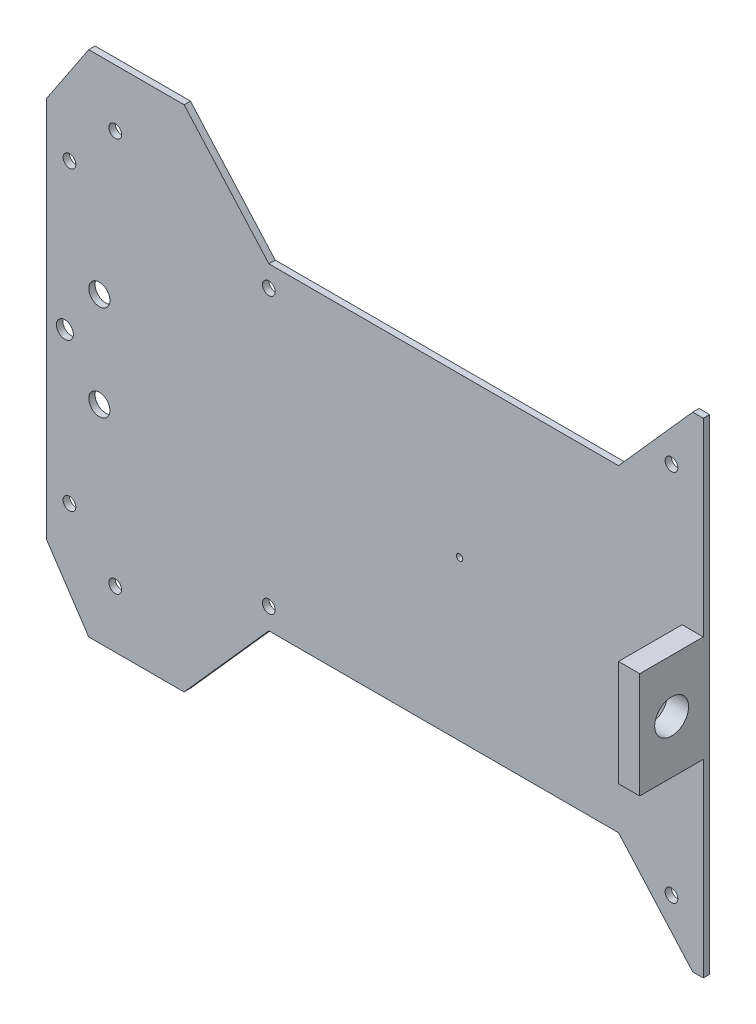
ISO-10303-21;
HEADER;
FILE_DESCRIPTION(('STEP AP214'),'2;1');
FILE_NAME('part.step','',(''),(''),'','','');
FILE_SCHEMA(('AUTOMOTIVE_DESIGN { 1 0 10303 214 1 1 1 1 }'));
ENDSEC;
DATA;
#1=APPLICATION_CONTEXT('core data for automotive mechanical design processes');
#2=APPLICATION_PROTOCOL_DEFINITION('international standard','automotive_design',2000,#1);
#3=PRODUCT_CONTEXT('',#1,'mechanical');
#4=PRODUCT('Part','Part','',(#3));
#5=PRODUCT_RELATED_PRODUCT_CATEGORY('part','',(#4));
#6=PRODUCT_DEFINITION_FORMATION('','',#4);
#7=PRODUCT_DEFINITION_CONTEXT('part definition',#1,'design');
#8=PRODUCT_DEFINITION('design','',#6,#7);
#9=PRODUCT_DEFINITION_SHAPE('','',#8);
#10=(LENGTH_UNIT() NAMED_UNIT(*) SI_UNIT(.MILLI.,.METRE.));
#11=(NAMED_UNIT(*) PLANE_ANGLE_UNIT() SI_UNIT($,.RADIAN.));
#12=(NAMED_UNIT(*) SI_UNIT($,.STERADIAN.) SOLID_ANGLE_UNIT());
#13=UNCERTAINTY_MEASURE_WITH_UNIT(LENGTH_MEASURE(1.E-05),#10,'distance_accuracy_value','');
#14=(GEOMETRIC_REPRESENTATION_CONTEXT(3) GLOBAL_UNCERTAINTY_ASSIGNED_CONTEXT((#13)) GLOBAL_UNIT_ASSIGNED_CONTEXT((#10,
#11,#12)) REPRESENTATION_CONTEXT('',''));
#15=CARTESIAN_POINT('',(0.,0.,0.));
#16=DIRECTION('',(0.,0.,1.));
#17=DIRECTION('',(1.,0.,0.));
#18=AXIS2_PLACEMENT_3D('',#15,#16,#17);
#19=CARTESIAN_POINT('',(0.,0.,3.));
#20=DIRECTION('',(0.,0.,1.));
#21=DIRECTION('',(1.,0.,0.));
#22=AXIS2_PLACEMENT_3D('',#19,#20,#21);
#23=PLANE('',#22);
#24=CARTESIAN_POINT('',(-186.250000000001,0.,3.));
#25=DIRECTION('',(0.,0.,1.));
#26=DIRECTION('',(1.,0.,0.));
#27=AXIS2_PLACEMENT_3D('',#24,#25,#26);
#28=CIRCLE('',#27,3.99999999999999);
#29=CARTESIAN_POINT('',(-182.250000000001,0.,3.));
#30=VERTEX_POINT('',#29);
#31=EDGE_CURVE('E358',#30,#30,#28,.T.);
#32=ORIENTED_EDGE('',*,*,#31,.F.);
#33=EDGE_LOOP('',(#32));
#34=FACE_BOUND('',#33,.T.);
#35=CARTESIAN_POINT('',(0.,0.,3.));
#36=DIRECTION('',(0.,0.,1.));
#37=DIRECTION('',(1.,0.,0.));
#38=AXIS2_PLACEMENT_3D('',#35,#36,#37);
#39=CIRCLE('',#38,1.5);
#40=CARTESIAN_POINT('',(1.5,0.,3.));
#41=VERTEX_POINT('',#40);
#42=EDGE_CURVE('E348',#41,#41,#39,.T.);
#43=ORIENTED_EDGE('',*,*,#42,.F.);
#44=EDGE_LOOP('',(#43));
#45=FACE_BOUND('',#44,.T.);
#46=CARTESIAN_POINT('',(-170.,-22.4999999999999,3.));
#47=DIRECTION('',(0.,0.,1.));
#48=DIRECTION('',(1.,0.,0.));
#49=AXIS2_PLACEMENT_3D('',#46,#47,#48);
#50=CIRCLE('',#49,4.99999999999999);
#51=CARTESIAN_POINT('',(-165.,-22.4999999999999,3.));
#52=VERTEX_POINT('',#51);
#53=EDGE_CURVE('E347',#52,#52,#50,.F.);
#54=ORIENTED_EDGE('',*,*,#53,.T.);
#55=EDGE_LOOP('',(#54));
#56=FACE_BOUND('',#55,.T.);
#57=CARTESIAN_POINT('',(-162.5,93.0000000000001,3.));
#58=DIRECTION('',(0.,0.,1.));
#59=DIRECTION('',(1.,0.,0.));
#60=AXIS2_PLACEMENT_3D('',#57,#58,#59);
#61=CIRCLE('',#60,2.99999999999999);
#62=CARTESIAN_POINT('',(-159.5,93.0000000000001,3.));
#63=VERTEX_POINT('',#62);
#64=EDGE_CURVE('E367',#63,#63,#61,.F.);
#65=ORIENTED_EDGE('',*,*,#64,.T.);
#66=EDGE_LOOP('',(#65));
#67=FACE_BOUND('',#66,.T.);
#68=CARTESIAN_POINT('',(-162.5,-93.,3.));
#69=DIRECTION('',(0.,0.,1.));
#70=DIRECTION('',(1.,0.,0.));
#71=AXIS2_PLACEMENT_3D('',#68,#69,#70);
#72=CIRCLE('',#71,2.99999999999999);
#73=CARTESIAN_POINT('',(-159.5,-93.,3.));
#74=VERTEX_POINT('',#73);
#75=EDGE_CURVE('E370',#74,#74,#72,.T.);
#76=ORIENTED_EDGE('',*,*,#75,.F.);
#77=EDGE_LOOP('',(#76));
#78=FACE_BOUND('',#77,.T.);
#79=CARTESIAN_POINT('',(-90.0000000000001,65.0000000000001,3.));
#80=DIRECTION('',(0.,0.,1.));
#81=DIRECTION('',(1.,0.,0.));
#82=AXIS2_PLACEMENT_3D('',#79,#80,#81);
#83=CIRCLE('',#82,3.00000000000001);
#84=CARTESIAN_POINT('',(-87.,65.0000000000001,3.));
#85=VERTEX_POINT('',#84);
#86=EDGE_CURVE('E379',#85,#85,#83,.T.);
#87=ORIENTED_EDGE('',*,*,#86,.F.);
#88=EDGE_LOOP('',(#87));
#89=FACE_BOUND('',#88,.T.);
#90=CARTESIAN_POINT('',(-90.0000000000001,-65.0000000000001,3.));
#91=DIRECTION('',(0.,0.,1.));
#92=DIRECTION('',(-1.,0.,0.));
#93=AXIS2_PLACEMENT_3D('',#90,#91,#92);
#94=CIRCLE('',#93,3.00000000000001);
#95=CARTESIAN_POINT('',(-93.0000000000001,-65.0000000000001,3.));
#96=VERTEX_POINT('',#95);
#97=EDGE_CURVE('E382',#96,#96,#94,.T.);
#98=ORIENTED_EDGE('',*,*,#97,.F.);
#99=EDGE_LOOP('',(#98));
#100=FACE_BOUND('',#99,.T.);
#101=CARTESIAN_POINT('',(99.9999999999999,-88.0730067765097,3.));
#102=DIRECTION('',(0.,0.,1.));
#103=DIRECTION('',(1.,0.,0.));
#104=AXIS2_PLACEMENT_3D('',#101,#102,#103);
#105=CIRCLE('',#104,3.00000000000001);
#106=CARTESIAN_POINT('',(103.,-88.0730067765097,3.));
#107=VERTEX_POINT('',#106);
#108=EDGE_CURVE('E390',#107,#107,#105,.T.);
#109=ORIENTED_EDGE('',*,*,#108,.F.);
#110=EDGE_LOOP('',(#109));
#111=FACE_BOUND('',#110,.T.);
#112=CARTESIAN_POINT('',(99.9999999999999,88.0730067765097,3.));
#113=DIRECTION('',(0.,0.,1.));
#114=DIRECTION('',(-1.,0.,0.));
#115=AXIS2_PLACEMENT_3D('',#112,#113,#114);
#116=CIRCLE('',#115,3.00000000000001);
#117=CARTESIAN_POINT('',(96.9999999999999,88.0730067765097,3.));
#118=VERTEX_POINT('',#117);
#119=EDGE_CURVE('E393',#118,#118,#116,.T.);
#120=ORIENTED_EDGE('',*,*,#119,.F.);
#121=EDGE_LOOP('',(#120));
#122=FACE_BOUND('',#121,.T.);
#123=DIRECTION('',(1.,0.,0.));
#124=VECTOR('',#123,1.);
#125=CARTESIAN_POINT('',(115.,-25.,3.));
#126=LINE('',#125,#124);
#127=CARTESIAN_POINT('',(105.,-25.,3.));
#128=VERTEX_POINT('',#127);
#129=CARTESIAN_POINT('',(115.,-25.,3.));
#130=VERTEX_POINT('',#129);
#131=EDGE_CURVE('E84',#128,#130,#126,.T.);
#132=ORIENTED_EDGE('',*,*,#131,.F.);
#133=DIRECTION('',(0.,-1.,0.));
#134=VECTOR('',#133,1.);
#135=CARTESIAN_POINT('',(105.,25.,3.));
#136=LINE('',#135,#134);
#137=CARTESIAN_POINT('',(105.,25.,3.));
#138=VERTEX_POINT('',#137);
#139=EDGE_CURVE('E404',#138,#128,#136,.T.);
#140=ORIENTED_EDGE('',*,*,#139,.F.);
#141=DIRECTION('',(-1.,0.,0.));
#142=VECTOR('',#141,1.);
#143=CARTESIAN_POINT('',(115.,25.,3.));
#144=LINE('',#143,#142);
#145=CARTESIAN_POINT('',(115.,25.,3.));
#146=VERTEX_POINT('',#145);
#147=EDGE_CURVE('E336',#146,#138,#144,.T.);
#148=ORIENTED_EDGE('',*,*,#147,.F.);
#149=DIRECTION('',(0.,-1.,0.));
#150=VECTOR('',#149,1.);
#151=CARTESIAN_POINT('',(115.,0.,3.));
#152=LINE('',#151,#150);
#153=CARTESIAN_POINT('',(115.,114.376866735393,3.));
#154=VERTEX_POINT('',#153);
#155=EDGE_CURVE('E216',#154,#146,#152,.T.);
#156=ORIENTED_EDGE('',*,*,#155,.F.);
#157=DIRECTION('',(-1.,0.,0.));
#158=VECTOR('',#157,1.);
#159=CARTESIAN_POINT('',(0.,114.376866735393,3.));
#160=LINE('',#159,#158);
#161=CARTESIAN_POINT('',(110.001659320349,114.376866735393,3.));
#162=VERTEX_POINT('',#161);
#163=EDGE_CURVE('E217',#154,#162,#160,.T.);
#164=ORIENTED_EDGE('',*,*,#163,.T.);
#165=DIRECTION('',(-0.66436383882992,-0.74740931868366,0.));
#166=VECTOR('',#165,1.);
#167=CARTESIAN_POINT('',(4.65517241379303,-4.13793103448269,3.));
#168=LINE('',#167,#166);
#169=CARTESIAN_POINT('',(74.9999999999999,75.0000000000001,3.));
#170=VERTEX_POINT('',#169);
#171=EDGE_CURVE('E257',#162,#170,#168,.T.);
#172=ORIENTED_EDGE('',*,*,#171,.T.);
#173=DIRECTION('',(-1.,0.,0.));
#174=VECTOR('',#173,1.);
#175=CARTESIAN_POINT('',(0.,75.0000000000001,3.));
#176=LINE('',#175,#174);
#177=CARTESIAN_POINT('',(-90.0000000000001,75.,3.));
#178=VERTEX_POINT('',#177);
#179=EDGE_CURVE('E264',#170,#178,#176,.T.);
#180=ORIENTED_EDGE('',*,*,#179,.T.);
#181=DIRECTION('',(0.66436383882992,-0.74740931868366,0.));
#182=VECTOR('',#181,1.);
#183=CARTESIAN_POINT('',(-13.0344827586207,-11.5862068965517,3.));
#184=LINE('',#183,#182);
#185=CARTESIAN_POINT('',(-130.,120.,3.));
#186=VERTEX_POINT('',#185);
#187=EDGE_CURVE('E262',#186,#178,#184,.T.);
#188=ORIENTED_EDGE('',*,*,#187,.F.);
#189=DIRECTION('',(1.,0.,0.));
#190=VECTOR('',#189,1.);
#191=CARTESIAN_POINT('',(0.,120.,3.));
#192=LINE('',#191,#190);
#193=CARTESIAN_POINT('',(-175.,120.,3.));
#194=VERTEX_POINT('',#193);
#195=EDGE_CURVE('E258',#194,#186,#192,.T.);
#196=ORIENTED_EDGE('',*,*,#195,.F.);
#197=DIRECTION('',(-0.554700196225229,-0.832050294337844,0.));
#198=VECTOR('',#197,1.);
#199=CARTESIAN_POINT('',(-176.538461538462,117.692307692308,3.));
#200=LINE('',#199,#198);
#201=CARTESIAN_POINT('',(-195.,90.,3.));
#202=VERTEX_POINT('',#201);
#203=EDGE_CURVE('E261',#194,#202,#200,.T.);
#204=ORIENTED_EDGE('',*,*,#203,.T.);
#205=DIRECTION('',(0.,-1.,0.));
#206=VECTOR('',#205,1.);
#207=CARTESIAN_POINT('',(-195.,0.,3.));
#208=LINE('',#207,#206);
#209=CARTESIAN_POINT('',(-195.,-90.,3.));
#210=VERTEX_POINT('',#209);
#211=EDGE_CURVE('E242',#202,#210,#208,.T.);
#212=ORIENTED_EDGE('',*,*,#211,.T.);
#213=DIRECTION('',(-0.554700196225229,0.832050294337844,0.));
#214=VECTOR('',#213,1.);
#215=CARTESIAN_POINT('',(-176.538461538462,-117.692307692308,3.));
#216=LINE('',#215,#214);
#217=CARTESIAN_POINT('',(-175.,-120.,3.));
#218=VERTEX_POINT('',#217);
#219=EDGE_CURVE('E244',#218,#210,#216,.T.);
#220=ORIENTED_EDGE('',*,*,#219,.F.);
#221=DIRECTION('',(1.,0.,0.));
#222=VECTOR('',#221,1.);
#223=CARTESIAN_POINT('',(0.,-120.,3.));
#224=LINE('',#223,#222);
#225=CARTESIAN_POINT('',(-130.,-120.,3.));
#226=VERTEX_POINT('',#225);
#227=EDGE_CURVE('E248',#218,#226,#224,.T.);
#228=ORIENTED_EDGE('',*,*,#227,.T.);
#229=DIRECTION('',(0.66436383882992,0.74740931868366,0.));
#230=VECTOR('',#229,1.);
#231=CARTESIAN_POINT('',(-13.0344827586207,11.5862068965517,3.));
#232=LINE('',#231,#230);
#233=CARTESIAN_POINT('',(-90.0000000000001,-75.,3.));
#234=VERTEX_POINT('',#233);
#235=EDGE_CURVE('E250',#226,#234,#232,.T.);
#236=ORIENTED_EDGE('',*,*,#235,.T.);
#237=DIRECTION('',(1.,0.,0.));
#238=VECTOR('',#237,1.);
#239=CARTESIAN_POINT('',(0.,-75.,3.));
#240=LINE('',#239,#238);
#241=CARTESIAN_POINT('',(74.9999999999999,-75.,3.));
#242=VERTEX_POINT('',#241);
#243=EDGE_CURVE('E252',#234,#242,#240,.T.);
#244=ORIENTED_EDGE('',*,*,#243,.T.);
#245=DIRECTION('',(-0.66436383882992,0.74740931868366,0.));
#246=VECTOR('',#245,1.);
#247=CARTESIAN_POINT('',(4.65517241379303,4.13793103448269,3.));
#248=LINE('',#247,#246);
#249=CARTESIAN_POINT('',(110.,-114.375,3.));
#250=VERTEX_POINT('',#249);
#251=EDGE_CURVE('E255',#250,#242,#248,.T.);
#252=ORIENTED_EDGE('',*,*,#251,.F.);
#253=DIRECTION('',(-1.,0.,0.));
#254=VECTOR('',#253,1.);
#255=CARTESIAN_POINT('',(0.,-114.375,3.));
#256=LINE('',#255,#254);
#257=CARTESIAN_POINT('',(115.,-114.375,3.));
#258=VERTEX_POINT('',#257);
#259=EDGE_CURVE('E226',#258,#250,#256,.T.);
#260=ORIENTED_EDGE('',*,*,#259,.F.);
#261=EDGE_CURVE('E89',#130,#258,#152,.T.);
#262=ORIENTED_EDGE('',*,*,#261,.F.);
#263=EDGE_LOOP('',(#132,#140,#148,#156,#164,#172,#180,#188,#196,#204,#212,#220,#228,#236,#244,
#252,#260,#262));
#264=FACE_BOUND('',#263,.T.);
#265=CARTESIAN_POINT('',(-184.089468204594,-70.,3.));
#266=DIRECTION('',(0.,0.,1.));
#267=DIRECTION('',(1.,0.,0.));
#268=AXIS2_PLACEMENT_3D('',#265,#266,#267);
#269=CIRCLE('',#268,2.99999999999999);
#270=CARTESIAN_POINT('',(-181.089468204594,-70.,3.));
#271=VERTEX_POINT('',#270);
#272=EDGE_CURVE('E269',#271,#271,#269,.F.);
#273=ORIENTED_EDGE('',*,*,#272,.T.);
#274=EDGE_LOOP('',(#273));
#275=FACE_BOUND('',#274,.T.);
#276=CARTESIAN_POINT('',(-184.089468204594,70.,3.));
#277=DIRECTION('',(0.,0.,1.));
#278=DIRECTION('',(1.,0.,0.));
#279=AXIS2_PLACEMENT_3D('',#276,#277,#278);
#280=CIRCLE('',#279,2.99999999999999);
#281=CARTESIAN_POINT('',(-181.089468204594,70.,3.));
#282=VERTEX_POINT('',#281);
#283=EDGE_CURVE('E272',#282,#282,#280,.T.);
#284=ORIENTED_EDGE('',*,*,#283,.F.);
#285=EDGE_LOOP('',(#284));
#286=FACE_BOUND('',#285,.T.);
#287=CARTESIAN_POINT('',(-170.,22.5,3.));
#288=DIRECTION('',(0.,0.,1.));
#289=DIRECTION('',(1.,0.,0.));
#290=AXIS2_PLACEMENT_3D('',#287,#288,#289);
#291=CIRCLE('',#290,4.99999999999999);
#292=CARTESIAN_POINT('',(-165.,22.5,3.));
#293=VERTEX_POINT('',#292);
#294=EDGE_CURVE('E342',#293,#293,#291,.T.);
#295=ORIENTED_EDGE('',*,*,#294,.F.);
#296=EDGE_LOOP('',(#295));
#297=FACE_BOUND('',#296,.T.);
#298=ADVANCED_FACE('F67',(#34,#45,#56,#67,#78,#89,#100,#111,#122,#264,#275,#286,#297),#23,.T.);
#299=CARTESIAN_POINT('',(0.,0.,0.));
#300=DIRECTION('',(0.,0.,1.));
#301=DIRECTION('',(1.,0.,0.));
#302=AXIS2_PLACEMENT_3D('',#299,#300,#301);
#303=PLANE('',#302);
#304=CARTESIAN_POINT('',(-186.250000000001,0.,0.));
#305=DIRECTION('',(0.,0.,1.));
#306=DIRECTION('',(1.,0.,0.));
#307=AXIS2_PLACEMENT_3D('',#304,#305,#306);
#308=CIRCLE('',#307,3.99999999999999);
#309=CARTESIAN_POINT('',(-182.250000000001,0.,0.));
#310=VERTEX_POINT('',#309);
#311=EDGE_CURVE('E71',#310,#310,#308,.T.);
#312=ORIENTED_EDGE('',*,*,#311,.T.);
#313=EDGE_LOOP('',(#312));
#314=FACE_BOUND('',#313,.T.);
#315=CARTESIAN_POINT('',(0.,0.,0.));
#316=DIRECTION('',(0.,0.,1.));
#317=DIRECTION('',(1.,0.,0.));
#318=AXIS2_PLACEMENT_3D('',#315,#316,#317);
#319=CIRCLE('',#318,1.5);
#320=CARTESIAN_POINT('',(1.5,0.,0.));
#321=VERTEX_POINT('',#320);
#322=EDGE_CURVE('E345',#321,#321,#319,.T.);
#323=ORIENTED_EDGE('',*,*,#322,.T.);
#324=EDGE_LOOP('',(#323));
#325=FACE_BOUND('',#324,.T.);
#326=CARTESIAN_POINT('',(-162.5,93.0000000000001,0.));
#327=DIRECTION('',(0.,0.,1.));
#328=DIRECTION('',(1.,0.,0.));
#329=AXIS2_PLACEMENT_3D('',#326,#327,#328);
#330=CIRCLE('',#329,2.99999999999999);
#331=CARTESIAN_POINT('',(-159.5,93.0000000000001,0.));
#332=VERTEX_POINT('',#331);
#333=EDGE_CURVE('E363',#332,#332,#330,.F.);
#334=ORIENTED_EDGE('',*,*,#333,.F.);
#335=EDGE_LOOP('',(#334));
#336=FACE_BOUND('',#335,.T.);
#337=CARTESIAN_POINT('',(-184.089468204594,-70.,0.));
#338=DIRECTION('',(0.,0.,1.));
#339=DIRECTION('',(1.,0.,0.));
#340=AXIS2_PLACEMENT_3D('',#337,#338,#339);
#341=CIRCLE('',#340,2.99999999999999);
#342=CARTESIAN_POINT('',(-181.089468204594,-70.,0.));
#343=VERTEX_POINT('',#342);
#344=EDGE_CURVE('E302',#343,#343,#341,.F.);
#345=ORIENTED_EDGE('',*,*,#344,.F.);
#346=EDGE_LOOP('',(#345));
#347=FACE_BOUND('',#346,.T.);
#348=DIRECTION('',(-1.,0.,0.));
#349=VECTOR('',#348,1.);
#350=CARTESIAN_POINT('',(0.,114.376866735393,0.));
#351=LINE('',#350,#349);
#352=CARTESIAN_POINT('',(115.,114.376866735393,0.));
#353=VERTEX_POINT('',#352);
#354=CARTESIAN_POINT('',(110.001659320349,114.376866735393,0.));
#355=VERTEX_POINT('',#354);
#356=EDGE_CURVE('E76',#353,#355,#351,.T.);
#357=ORIENTED_EDGE('',*,*,#356,.F.);
#358=DIRECTION('',(0.,-1.,0.));
#359=VECTOR('',#358,1.);
#360=CARTESIAN_POINT('',(115.,0.,0.));
#361=LINE('',#360,#359);
#362=CARTESIAN_POINT('',(115.,-114.375,0.));
#363=VERTEX_POINT('',#362);
#364=EDGE_CURVE('E232',#353,#363,#361,.T.);
#365=ORIENTED_EDGE('',*,*,#364,.T.);
#366=DIRECTION('',(-1.,0.,0.));
#367=VECTOR('',#366,1.);
#368=CARTESIAN_POINT('',(0.,-114.375,0.));
#369=LINE('',#368,#367);
#370=CARTESIAN_POINT('',(110.,-114.375,0.));
#371=VERTEX_POINT('',#370);
#372=EDGE_CURVE('E12',#363,#371,#369,.T.);
#373=ORIENTED_EDGE('',*,*,#372,.T.);
#374=DIRECTION('',(-0.66436383882992,0.74740931868366,0.));
#375=VECTOR('',#374,1.);
#376=CARTESIAN_POINT('',(4.65517241379303,4.13793103448269,0.));
#377=LINE('',#376,#375);
#378=CARTESIAN_POINT('',(74.9999999999999,-75.,0.));
#379=VERTEX_POINT('',#378);
#380=EDGE_CURVE('E287',#371,#379,#377,.T.);
#381=ORIENTED_EDGE('',*,*,#380,.T.);
#382=DIRECTION('',(1.,0.,0.));
#383=VECTOR('',#382,1.);
#384=CARTESIAN_POINT('',(0.,-75.,0.));
#385=LINE('',#384,#383);
#386=CARTESIAN_POINT('',(-90.0000000000001,-75.,0.));
#387=VERTEX_POINT('',#386);
#388=EDGE_CURVE('E284',#387,#379,#385,.T.);
#389=ORIENTED_EDGE('',*,*,#388,.F.);
#390=DIRECTION('',(0.66436383882992,0.74740931868366,0.));
#391=VECTOR('',#390,1.);
#392=CARTESIAN_POINT('',(-13.0344827586207,11.5862068965517,0.));
#393=LINE('',#392,#391);
#394=CARTESIAN_POINT('',(-130.,-120.,0.));
#395=VERTEX_POINT('',#394);
#396=EDGE_CURVE('E282',#395,#387,#393,.T.);
#397=ORIENTED_EDGE('',*,*,#396,.F.);
#398=DIRECTION('',(1.,0.,0.));
#399=VECTOR('',#398,1.);
#400=CARTESIAN_POINT('',(0.,-120.,0.));
#401=LINE('',#400,#399);
#402=CARTESIAN_POINT('',(-175.,-120.,0.));
#403=VERTEX_POINT('',#402);
#404=EDGE_CURVE('E280',#403,#395,#401,.T.);
#405=ORIENTED_EDGE('',*,*,#404,.F.);
#406=DIRECTION('',(-0.554700196225229,0.832050294337844,0.));
#407=VECTOR('',#406,1.);
#408=CARTESIAN_POINT('',(-176.538461538462,-117.692307692308,0.));
#409=LINE('',#408,#407);
#410=CARTESIAN_POINT('',(-195.,-90.,0.));
#411=VERTEX_POINT('',#410);
#412=EDGE_CURVE('E277',#403,#411,#409,.T.);
#413=ORIENTED_EDGE('',*,*,#412,.T.);
#414=DIRECTION('',(0.,-1.,0.));
#415=VECTOR('',#414,1.);
#416=CARTESIAN_POINT('',(-195.,0.,0.));
#417=LINE('',#416,#415);
#418=CARTESIAN_POINT('',(-195.,90.,0.));
#419=VERTEX_POINT('',#418);
#420=EDGE_CURVE('E241',#419,#411,#417,.T.);
#421=ORIENTED_EDGE('',*,*,#420,.F.);
#422=DIRECTION('',(-0.554700196225229,-0.832050294337844,0.));
#423=VECTOR('',#422,1.);
#424=CARTESIAN_POINT('',(-176.538461538462,117.692307692308,0.));
#425=LINE('',#424,#423);
#426=CARTESIAN_POINT('',(-175.,120.,0.));
#427=VERTEX_POINT('',#426);
#428=EDGE_CURVE('E293',#427,#419,#425,.T.);
#429=ORIENTED_EDGE('',*,*,#428,.F.);
#430=DIRECTION('',(1.,0.,0.));
#431=VECTOR('',#430,1.);
#432=CARTESIAN_POINT('',(0.,120.,0.));
#433=LINE('',#432,#431);
#434=CARTESIAN_POINT('',(-130.,120.,0.));
#435=VERTEX_POINT('',#434);
#436=EDGE_CURVE('E290',#427,#435,#433,.T.);
#437=ORIENTED_EDGE('',*,*,#436,.T.);
#438=DIRECTION('',(0.66436383882992,-0.74740931868366,0.));
#439=VECTOR('',#438,1.);
#440=CARTESIAN_POINT('',(-13.0344827586207,-11.5862068965517,0.));
#441=LINE('',#440,#439);
#442=CARTESIAN_POINT('',(-90.0000000000001,75.,0.));
#443=VERTEX_POINT('',#442);
#444=EDGE_CURVE('E294',#435,#443,#441,.T.);
#445=ORIENTED_EDGE('',*,*,#444,.T.);
#446=DIRECTION('',(-1.,0.,0.));
#447=VECTOR('',#446,1.);
#448=CARTESIAN_POINT('',(0.,75.0000000000001,0.));
#449=LINE('',#448,#447);
#450=CARTESIAN_POINT('',(74.9999999999999,75.0000000000001,0.));
#451=VERTEX_POINT('',#450);
#452=EDGE_CURVE('E296',#451,#443,#449,.T.);
#453=ORIENTED_EDGE('',*,*,#452,.F.);
#454=DIRECTION('',(-0.66436383882992,-0.74740931868366,0.));
#455=VECTOR('',#454,1.);
#456=CARTESIAN_POINT('',(4.65517241379303,-4.13793103448269,0.));
#457=LINE('',#456,#455);
#458=EDGE_CURVE('E289',#355,#451,#457,.T.);
#459=ORIENTED_EDGE('',*,*,#458,.F.);
#460=EDGE_LOOP('',(#357,#365,#373,#381,#389,#397,#405,#413,#421,#429,#437,#445,#453,#459));
#461=FACE_BOUND('',#460,.T.);
#462=CARTESIAN_POINT('',(-184.089468204594,70.,0.));
#463=DIRECTION('',(0.,0.,1.));
#464=DIRECTION('',(1.,0.,0.));
#465=AXIS2_PLACEMENT_3D('',#462,#463,#464);
#466=CIRCLE('',#465,2.99999999999999);
#467=CARTESIAN_POINT('',(-181.089468204594,70.,0.));
#468=VERTEX_POINT('',#467);
#469=EDGE_CURVE('E245',#468,#468,#466,.T.);
#470=ORIENTED_EDGE('',*,*,#469,.T.);
#471=EDGE_LOOP('',(#470));
#472=FACE_BOUND('',#471,.T.);
#473=CARTESIAN_POINT('',(99.9999999999999,88.0730067765097,0.));
#474=DIRECTION('',(0.,0.,1.));
#475=DIRECTION('',(-1.,0.,0.));
#476=AXIS2_PLACEMENT_3D('',#473,#474,#475);
#477=CIRCLE('',#476,3.00000000000001);
#478=CARTESIAN_POINT('',(96.9999999999999,88.0730067765097,0.));
#479=VERTEX_POINT('',#478);
#480=EDGE_CURVE('E378',#479,#479,#477,.T.);
#481=ORIENTED_EDGE('',*,*,#480,.T.);
#482=EDGE_LOOP('',(#481));
#483=FACE_BOUND('',#482,.T.);
#484=CARTESIAN_POINT('',(99.9999999999999,-88.0730067765097,0.));
#485=DIRECTION('',(0.,0.,1.));
#486=DIRECTION('',(1.,0.,0.));
#487=AXIS2_PLACEMENT_3D('',#484,#485,#486);
#488=CIRCLE('',#487,3.00000000000001);
#489=CARTESIAN_POINT('',(103.,-88.0730067765097,0.));
#490=VERTEX_POINT('',#489);
#491=EDGE_CURVE('E387',#490,#490,#488,.T.);
#492=ORIENTED_EDGE('',*,*,#491,.T.);
#493=EDGE_LOOP('',(#492));
#494=FACE_BOUND('',#493,.T.);
#495=CARTESIAN_POINT('',(-90.0000000000001,-65.0000000000001,0.));
#496=DIRECTION('',(0.,0.,1.));
#497=DIRECTION('',(-1.,0.,0.));
#498=AXIS2_PLACEMENT_3D('',#495,#496,#497);
#499=CIRCLE('',#498,3.00000000000001);
#500=CARTESIAN_POINT('',(-93.0000000000001,-65.0000000000001,0.));
#501=VERTEX_POINT('',#500);
#502=EDGE_CURVE('E366',#501,#501,#499,.T.);
#503=ORIENTED_EDGE('',*,*,#502,.T.);
#504=EDGE_LOOP('',(#503));
#505=FACE_BOUND('',#504,.T.);
#506=CARTESIAN_POINT('',(-90.0000000000001,65.0000000000001,0.));
#507=DIRECTION('',(0.,0.,1.));
#508=DIRECTION('',(1.,0.,0.));
#509=AXIS2_PLACEMENT_3D('',#506,#507,#508);
#510=CIRCLE('',#509,3.00000000000001);
#511=CARTESIAN_POINT('',(-87.,65.0000000000001,0.));
#512=VERTEX_POINT('',#511);
#513=EDGE_CURVE('E375',#512,#512,#510,.T.);
#514=ORIENTED_EDGE('',*,*,#513,.T.);
#515=EDGE_LOOP('',(#514));
#516=FACE_BOUND('',#515,.T.);
#517=CARTESIAN_POINT('',(-162.5,-93.,0.));
#518=DIRECTION('',(0.,0.,1.));
#519=DIRECTION('',(1.,0.,0.));
#520=AXIS2_PLACEMENT_3D('',#517,#518,#519);
#521=CIRCLE('',#520,2.99999999999999);
#522=CARTESIAN_POINT('',(-159.5,-93.,0.));
#523=VERTEX_POINT('',#522);
#524=EDGE_CURVE('E344',#523,#523,#521,.T.);
#525=ORIENTED_EDGE('',*,*,#524,.T.);
#526=EDGE_LOOP('',(#525));
#527=FACE_BOUND('',#526,.T.);
#528=CARTESIAN_POINT('',(-170.,-22.4999999999999,0.));
#529=DIRECTION('',(0.,0.,1.));
#530=DIRECTION('',(1.,0.,0.));
#531=AXIS2_PLACEMENT_3D('',#528,#529,#530);
#532=CIRCLE('',#531,4.99999999999999);
#533=CARTESIAN_POINT('',(-165.,-22.4999999999999,0.));
#534=VERTEX_POINT('',#533);
#535=EDGE_CURVE('E338',#534,#534,#532,.F.);
#536=ORIENTED_EDGE('',*,*,#535,.F.);
#537=EDGE_LOOP('',(#536));
#538=FACE_BOUND('',#537,.T.);
#539=CARTESIAN_POINT('',(-170.,22.5,0.));
#540=DIRECTION('',(0.,0.,1.));
#541=DIRECTION('',(1.,0.,0.));
#542=AXIS2_PLACEMENT_3D('',#539,#540,#541);
#543=CIRCLE('',#542,4.99999999999999);
#544=CARTESIAN_POINT('',(-165.,22.5,0.));
#545=VERTEX_POINT('',#544);
#546=EDGE_CURVE('E341',#545,#545,#543,.T.);
#547=ORIENTED_EDGE('',*,*,#546,.T.);
#548=EDGE_LOOP('',(#547));
#549=FACE_BOUND('',#548,.T.);
#550=ADVANCED_FACE('F472',(#314,#325,#336,#347,#461,#472,#483,#494,#505,#516,#527,#538,#549),
#303,.F.);
#551=CARTESIAN_POINT('',(4.65517241379303,-4.13793103448269,3.));
#552=DIRECTION('',(0.74740931868366,-0.66436383882992,0.));
#553=DIRECTION('',(0.66436383882992,0.74740931868366,0.));
#554=AXIS2_PLACEMENT_3D('',#551,#552,#553);
#555=PLANE('',#554);
#556=DIRECTION('',(0.,0.,1.));
#557=VECTOR('',#556,1.);
#558=CARTESIAN_POINT('',(110.001659320349,114.376866735393,-7.));
#559=LINE('',#558,#557);
#560=EDGE_CURVE('E228',#355,#162,#559,.T.);
#561=ORIENTED_EDGE('',*,*,#560,.F.);
#562=ORIENTED_EDGE('',*,*,#458,.T.);
#563=DIRECTION('',(0.,0.,-1.));
#564=VECTOR('',#563,1.);
#565=CARTESIAN_POINT('',(74.9999999999999,75.0000000000001,3.));
#566=LINE('',#565,#564);
#567=EDGE_CURVE('E315',#170,#451,#566,.T.);
#568=ORIENTED_EDGE('',*,*,#567,.F.);
#569=ORIENTED_EDGE('',*,*,#171,.F.);
#570=EDGE_LOOP('',(#561,#562,#568,#569));
#571=FACE_BOUND('',#570,.T.);
#572=ADVANCED_FACE('F421',(#571),#555,.F.);
#573=CARTESIAN_POINT('',(-195.,0.,3.));
#574=DIRECTION('',(1.,0.,0.));
#575=DIRECTION('',(0.,1.,0.));
#576=AXIS2_PLACEMENT_3D('',#573,#574,#575);
#577=PLANE('',#576);
#578=ORIENTED_EDGE('',*,*,#420,.T.);
#579=DIRECTION('',(0.,0.,-1.));
#580=VECTOR('',#579,1.);
#581=CARTESIAN_POINT('',(-195.,-90.,3.));
#582=LINE('',#581,#580);
#583=EDGE_CURVE('E329',#210,#411,#582,.T.);
#584=ORIENTED_EDGE('',*,*,#583,.F.);
#585=ORIENTED_EDGE('',*,*,#211,.F.);
#586=DIRECTION('',(0.,0.,-1.));
#587=VECTOR('',#586,1.);
#588=CARTESIAN_POINT('',(-195.,90.,3.));
#589=LINE('',#588,#587);
#590=EDGE_CURVE('E275',#202,#419,#589,.T.);
#591=ORIENTED_EDGE('',*,*,#590,.T.);
#592=EDGE_LOOP('',(#578,#584,#585,#591));
#593=FACE_BOUND('',#592,.T.);
#594=ADVANCED_FACE('F69',(#593),#577,.F.);
#595=CARTESIAN_POINT('',(-176.538461538462,-117.692307692308,3.));
#596=DIRECTION('',(-0.832050294337844,-0.554700196225229,0.));
#597=DIRECTION('',(0.554700196225229,-0.832050294337844,0.));
#598=AXIS2_PLACEMENT_3D('',#595,#596,#597);
#599=PLANE('',#598);
#600=ORIENTED_EDGE('',*,*,#412,.F.);
#601=DIRECTION('',(0.,0.,-1.));
#602=VECTOR('',#601,1.);
#603=CARTESIAN_POINT('',(-175.,-120.,3.));
#604=LINE('',#603,#602);
#605=EDGE_CURVE('E327',#218,#403,#604,.T.);
#606=ORIENTED_EDGE('',*,*,#605,.F.);
#607=ORIENTED_EDGE('',*,*,#219,.T.);
#608=ORIENTED_EDGE('',*,*,#583,.T.);
#609=EDGE_LOOP('',(#600,#606,#607,#608));
#610=FACE_BOUND('',#609,.T.);
#611=ADVANCED_FACE('F447',(#610),#599,.T.);
#612=CARTESIAN_POINT('',(0.,-120.,3.));
#613=DIRECTION('',(0.,1.,0.));
#614=DIRECTION('',(0.,0.,1.));
#615=AXIS2_PLACEMENT_3D('',#612,#613,#614);
#616=PLANE('',#615);
#617=ORIENTED_EDGE('',*,*,#404,.T.);
#618=DIRECTION('',(0.,0.,-1.));
#619=VECTOR('',#618,1.);
#620=CARTESIAN_POINT('',(-130.,-120.,3.));
#621=LINE('',#620,#619);
#622=EDGE_CURVE('E324',#226,#395,#621,.T.);
#623=ORIENTED_EDGE('',*,*,#622,.F.);
#624=ORIENTED_EDGE('',*,*,#227,.F.);
#625=ORIENTED_EDGE('',*,*,#605,.T.);
#626=EDGE_LOOP('',(#617,#623,#624,#625));
#627=FACE_BOUND('',#626,.T.);
#628=ADVANCED_FACE('F452',(#627),#616,.F.);
#629=CARTESIAN_POINT('',(-13.0344827586207,11.5862068965517,3.));
#630=DIRECTION('',(-0.747409318683659,0.66436383882992,0.));
#631=DIRECTION('',(-0.66436383882992,-0.747409318683659,0.));
#632=AXIS2_PLACEMENT_3D('',#629,#630,#631);
#633=PLANE('',#632);
#634=ORIENTED_EDGE('',*,*,#396,.T.);
#635=DIRECTION('',(0.,0.,-1.));
#636=VECTOR('',#635,1.);
#637=CARTESIAN_POINT('',(-90.0000000000001,-75.,3.));
#638=LINE('',#637,#636);
#639=EDGE_CURVE('E321',#234,#387,#638,.T.);
#640=ORIENTED_EDGE('',*,*,#639,.F.);
#641=ORIENTED_EDGE('',*,*,#235,.F.);
#642=ORIENTED_EDGE('',*,*,#622,.T.);
#643=EDGE_LOOP('',(#634,#640,#641,#642));
#644=FACE_BOUND('',#643,.T.);
#645=ADVANCED_FACE('F459',(#644),#633,.F.);
#646=CARTESIAN_POINT('',(0.,-75.,3.));
#647=DIRECTION('',(0.,1.,0.));
#648=DIRECTION('',(0.,0.,1.));
#649=AXIS2_PLACEMENT_3D('',#646,#647,#648);
#650=PLANE('',#649);
#651=ORIENTED_EDGE('',*,*,#388,.T.);
#652=DIRECTION('',(0.,0.,-1.));
#653=VECTOR('',#652,1.);
#654=CARTESIAN_POINT('',(74.9999999999999,-75.,3.));
#655=LINE('',#654,#653);
#656=EDGE_CURVE('E318',#242,#379,#655,.T.);
#657=ORIENTED_EDGE('',*,*,#656,.F.);
#658=ORIENTED_EDGE('',*,*,#243,.F.);
#659=ORIENTED_EDGE('',*,*,#639,.T.);
#660=EDGE_LOOP('',(#651,#657,#658,#659));
#661=FACE_BOUND('',#660,.T.);
#662=ADVANCED_FACE('F463',(#661),#650,.F.);
#663=CARTESIAN_POINT('',(4.65517241379303,4.13793103448269,3.));
#664=DIRECTION('',(-0.74740931868366,-0.66436383882992,0.));
#665=DIRECTION('',(0.66436383882992,-0.74740931868366,0.));
#666=AXIS2_PLACEMENT_3D('',#663,#664,#665);
#667=PLANE('',#666);
#668=DIRECTION('',(0.,0.,1.));
#669=VECTOR('',#668,1.);
#670=CARTESIAN_POINT('',(110.,-114.375,-7.));
#671=LINE('',#670,#669);
#672=EDGE_CURVE('E229',#371,#250,#671,.T.);
#673=ORIENTED_EDGE('',*,*,#672,.T.);
#674=ORIENTED_EDGE('',*,*,#251,.T.);
#675=ORIENTED_EDGE('',*,*,#656,.T.);
#676=ORIENTED_EDGE('',*,*,#380,.F.);
#677=EDGE_LOOP('',(#673,#674,#675,#676));
#678=FACE_BOUND('',#677,.T.);
#679=ADVANCED_FACE('F466',(#678),#667,.T.);
#680=CARTESIAN_POINT('',(0.,75.0000000000001,3.));
#681=DIRECTION('',(0.,-1.,0.));
#682=DIRECTION('',(0.,0.,-1.));
#683=AXIS2_PLACEMENT_3D('',#680,#681,#682);
#684=PLANE('',#683);
#685=ORIENTED_EDGE('',*,*,#452,.T.);
#686=DIRECTION('',(0.,0.,-1.));
#687=VECTOR('',#686,1.);
#688=CARTESIAN_POINT('',(-90.0000000000001,75.,3.));
#689=LINE('',#688,#687);
#690=EDGE_CURVE('E313',#178,#443,#689,.T.);
#691=ORIENTED_EDGE('',*,*,#690,.F.);
#692=ORIENTED_EDGE('',*,*,#179,.F.);
#693=ORIENTED_EDGE('',*,*,#567,.T.);
#694=EDGE_LOOP('',(#685,#691,#692,#693));
#695=FACE_BOUND('',#694,.T.);
#696=ADVANCED_FACE('F427',(#695),#684,.F.);
#697=CARTESIAN_POINT('',(-13.0344827586207,-11.5862068965517,3.));
#698=DIRECTION('',(0.747409318683659,0.66436383882992,0.));
#699=DIRECTION('',(-0.66436383882992,0.747409318683659,0.));
#700=AXIS2_PLACEMENT_3D('',#697,#698,#699);
#701=PLANE('',#700);
#702=ORIENTED_EDGE('',*,*,#444,.F.);
#703=DIRECTION('',(0.,0.,-1.));
#704=VECTOR('',#703,1.);
#705=CARTESIAN_POINT('',(-130.,120.,3.));
#706=LINE('',#705,#704);
#707=EDGE_CURVE('E311',#186,#435,#706,.T.);
#708=ORIENTED_EDGE('',*,*,#707,.F.);
#709=ORIENTED_EDGE('',*,*,#187,.T.);
#710=ORIENTED_EDGE('',*,*,#690,.T.);
#711=EDGE_LOOP('',(#702,#708,#709,#710));
#712=FACE_BOUND('',#711,.T.);
#713=ADVANCED_FACE('F507',(#712),#701,.T.);
#714=CARTESIAN_POINT('',(0.,120.,3.));
#715=DIRECTION('',(0.,1.,0.));
#716=DIRECTION('',(-1.,0.,0.));
#717=AXIS2_PLACEMENT_3D('',#714,#715,#716);
#718=PLANE('',#717);
#719=ORIENTED_EDGE('',*,*,#436,.F.);
#720=DIRECTION('',(0.,0.,-1.));
#721=VECTOR('',#720,1.);
#722=CARTESIAN_POINT('',(-175.,120.,3.));
#723=LINE('',#722,#721);
#724=EDGE_CURVE('E309',#194,#427,#723,.T.);
#725=ORIENTED_EDGE('',*,*,#724,.F.);
#726=ORIENTED_EDGE('',*,*,#195,.T.);
#727=ORIENTED_EDGE('',*,*,#707,.T.);
#728=EDGE_LOOP('',(#719,#725,#726,#727));
#729=FACE_BOUND('',#728,.T.);
#730=ADVANCED_FACE('F433',(#729),#718,.T.);
#731=CARTESIAN_POINT('',(-184.089468204594,70.,3.));
#732=DIRECTION('',(0.,0.,-1.));
#733=DIRECTION('',(-1.,0.,0.));
#734=AXIS2_PLACEMENT_3D('',#731,#732,#733);
#735=CYLINDRICAL_SURFACE('',#734,2.99999999999999);
#736=ORIENTED_EDGE('',*,*,#283,.T.);
#737=EDGE_LOOP('',(#736));
#738=FACE_BOUND('',#737,.T.);
#739=ORIENTED_EDGE('',*,*,#469,.F.);
#740=EDGE_LOOP('',(#739));
#741=FACE_BOUND('',#740,.T.);
#742=ADVANCED_FACE('F495',(#738,#741),#735,.F.);
#743=CARTESIAN_POINT('',(-184.089468204594,-70.,3.));
#744=DIRECTION('',(0.,0.,-1.));
#745=DIRECTION('',(-1.,0.,0.));
#746=AXIS2_PLACEMENT_3D('',#743,#744,#745);
#747=CYLINDRICAL_SURFACE('',#746,2.99999999999999);
#748=ORIENTED_EDGE('',*,*,#272,.F.);
#749=EDGE_LOOP('',(#748));
#750=FACE_BOUND('',#749,.T.);
#751=ORIENTED_EDGE('',*,*,#344,.T.);
#752=EDGE_LOOP('',(#751));
#753=FACE_BOUND('',#752,.T.);
#754=ADVANCED_FACE('F498',(#750,#753),#747,.F.);
#755=CARTESIAN_POINT('',(-176.538461538462,117.692307692308,3.));
#756=DIRECTION('',(0.832050294337844,-0.554700196225229,0.));
#757=DIRECTION('',(0.554700196225229,0.832050294337844,0.));
#758=AXIS2_PLACEMENT_3D('',#755,#756,#757);
#759=PLANE('',#758);
#760=ORIENTED_EDGE('',*,*,#428,.T.);
#761=ORIENTED_EDGE('',*,*,#590,.F.);
#762=ORIENTED_EDGE('',*,*,#203,.F.);
#763=ORIENTED_EDGE('',*,*,#724,.T.);
#764=EDGE_LOOP('',(#760,#761,#762,#763));
#765=FACE_BOUND('',#764,.T.);
#766=ADVANCED_FACE('F439',(#765),#759,.F.);
#767=CARTESIAN_POINT('',(0.,-114.375,-7.));
#768=DIRECTION('',(0.,1.,0.));
#769=DIRECTION('',(0.,0.,1.));
#770=AXIS2_PLACEMENT_3D('',#767,#768,#769);
#771=PLANE('',#770);
#772=DIRECTION('',(0.,0.,1.));
#773=VECTOR('',#772,1.);
#774=CARTESIAN_POINT('',(115.,-114.375,-7.));
#775=LINE('',#774,#773);
#776=EDGE_CURVE('E233',#363,#258,#775,.T.);
#777=ORIENTED_EDGE('',*,*,#776,.T.);
#778=ORIENTED_EDGE('',*,*,#259,.T.);
#779=ORIENTED_EDGE('',*,*,#672,.F.);
#780=ORIENTED_EDGE('',*,*,#372,.F.);
#781=EDGE_LOOP('',(#777,#778,#779,#780));
#782=FACE_BOUND('',#781,.T.);
#783=ADVANCED_FACE('F468',(#782),#771,.F.);
#784=CARTESIAN_POINT('',(0.,114.376866735393,-7.));
#785=DIRECTION('',(0.,1.,0.));
#786=DIRECTION('',(0.,0.,1.));
#787=AXIS2_PLACEMENT_3D('',#784,#785,#786);
#788=PLANE('',#787);
#789=ORIENTED_EDGE('',*,*,#356,.T.);
#790=ORIENTED_EDGE('',*,*,#560,.T.);
#791=ORIENTED_EDGE('',*,*,#163,.F.);
#792=DIRECTION('',(0.,0.,1.));
#793=VECTOR('',#792,1.);
#794=CARTESIAN_POINT('',(115.,114.376866735393,-7.));
#795=LINE('',#794,#793);
#796=EDGE_CURVE('E236',#353,#154,#795,.T.);
#797=ORIENTED_EDGE('',*,*,#796,.F.);
#798=EDGE_LOOP('',(#789,#790,#791,#797));
#799=FACE_BOUND('',#798,.T.);
#800=ADVANCED_FACE('F474',(#799),#788,.T.);
#801=CARTESIAN_POINT('',(115.,0.,-7.));
#802=DIRECTION('',(-1.,0.,0.));
#803=DIRECTION('',(0.,0.,1.));
#804=AXIS2_PLACEMENT_3D('',#801,#802,#803);
#805=PLANE('',#804);
#806=CARTESIAN_POINT('',(115.,0.,17.9315857500342));
#807=DIRECTION('',(1.,0.,0.));
#808=DIRECTION('',(0.,0.,-1.));
#809=AXIS2_PLACEMENT_3D('',#806,#807,#808);
#810=CIRCLE('',#809,8.);
#811=CARTESIAN_POINT('',(115.,0.,9.93158575003417));
#812=VERTEX_POINT('',#811);
#813=EDGE_CURVE('E337',#812,#812,#810,.T.);
#814=ORIENTED_EDGE('',*,*,#813,.F.);
#815=EDGE_LOOP('',(#814));
#816=FACE_BOUND('',#815,.T.);
#817=ORIENTED_EDGE('',*,*,#364,.F.);
#818=ORIENTED_EDGE('',*,*,#796,.T.);
#819=ORIENTED_EDGE('',*,*,#155,.T.);
#820=DIRECTION('',(0.,0.,-1.));
#821=VECTOR('',#820,1.);
#822=CARTESIAN_POINT('',(115.,25.,33.));
#823=LINE('',#822,#821);
#824=CARTESIAN_POINT('',(115.,25.,33.));
#825=VERTEX_POINT('',#824);
#826=EDGE_CURVE('E197',#825,#146,#823,.T.);
#827=ORIENTED_EDGE('',*,*,#826,.F.);
#828=DIRECTION('',(0.,1.,0.));
#829=VECTOR('',#828,1.);
#830=CARTESIAN_POINT('',(115.,25.,33.));
#831=LINE('',#830,#829);
#832=CARTESIAN_POINT('',(115.,-25.,33.));
#833=VERTEX_POINT('',#832);
#834=EDGE_CURVE('E203',#833,#825,#831,.T.);
#835=ORIENTED_EDGE('',*,*,#834,.F.);
#836=DIRECTION('',(0.,0.,-1.));
#837=VECTOR('',#836,1.);
#838=CARTESIAN_POINT('',(115.,-25.,33.));
#839=LINE('',#838,#837);
#840=EDGE_CURVE('E402',#833,#130,#839,.T.);
#841=ORIENTED_EDGE('',*,*,#840,.T.);
#842=ORIENTED_EDGE('',*,*,#261,.T.);
#843=ORIENTED_EDGE('',*,*,#776,.F.);
#844=EDGE_LOOP('',(#817,#818,#819,#827,#835,#841,#842,#843));
#845=FACE_BOUND('',#844,.T.);
#846=ADVANCED_FACE('F214',(#816,#845),#805,.F.);
#847=CARTESIAN_POINT('',(115.,25.,33.));
#848=DIRECTION('',(0.,-1.,0.));
#849=DIRECTION('',(1.,0.,0.));
#850=AXIS2_PLACEMENT_3D('',#847,#848,#849);
#851=PLANE('',#850);
#852=ORIENTED_EDGE('',*,*,#147,.T.);
#853=DIRECTION('',(0.,0.,-1.));
#854=VECTOR('',#853,1.);
#855=CARTESIAN_POINT('',(105.,25.,33.));
#856=LINE('',#855,#854);
#857=CARTESIAN_POINT('',(105.,25.,33.));
#858=VERTEX_POINT('',#857);
#859=EDGE_CURVE('E199',#858,#138,#856,.T.);
#860=ORIENTED_EDGE('',*,*,#859,.F.);
#861=DIRECTION('',(-1.,0.,0.));
#862=VECTOR('',#861,1.);
#863=CARTESIAN_POINT('',(115.,25.,33.));
#864=LINE('',#863,#862);
#865=EDGE_CURVE('E192',#825,#858,#864,.T.);
#866=ORIENTED_EDGE('',*,*,#865,.F.);
#867=ORIENTED_EDGE('',*,*,#826,.T.);
#868=EDGE_LOOP('',(#852,#860,#866,#867));
#869=FACE_BOUND('',#868,.T.);
#870=ADVANCED_FACE('F195',(#869),#851,.F.);
#871=CARTESIAN_POINT('',(105.,25.,33.));
#872=DIRECTION('',(1.,0.,0.));
#873=DIRECTION('',(0.,0.,-1.));
#874=AXIS2_PLACEMENT_3D('',#871,#872,#873);
#875=PLANE('',#874);
#876=CARTESIAN_POINT('',(105.,0.,17.9315857500342));
#877=DIRECTION('',(1.,0.,0.));
#878=DIRECTION('',(0.,0.,-1.));
#879=AXIS2_PLACEMENT_3D('',#876,#877,#878);
#880=CIRCLE('',#879,8.);
#881=CARTESIAN_POINT('',(105.,0.,9.93158575003417));
#882=VERTEX_POINT('',#881);
#883=EDGE_CURVE('E333',#882,#882,#880,.T.);
#884=ORIENTED_EDGE('',*,*,#883,.T.);
#885=EDGE_LOOP('',(#884));
#886=FACE_BOUND('',#885,.T.);
#887=ORIENTED_EDGE('',*,*,#139,.T.);
#888=DIRECTION('',(0.,0.,-1.));
#889=VECTOR('',#888,1.);
#890=CARTESIAN_POINT('',(105.,-25.,33.));
#891=LINE('',#890,#889);
#892=CARTESIAN_POINT('',(105.,-25.,33.));
#893=VERTEX_POINT('',#892);
#894=EDGE_CURVE('E221',#893,#128,#891,.T.);
#895=ORIENTED_EDGE('',*,*,#894,.F.);
#896=DIRECTION('',(0.,-1.,0.));
#897=VECTOR('',#896,1.);
#898=CARTESIAN_POINT('',(105.,25.,33.));
#899=LINE('',#898,#897);
#900=EDGE_CURVE('E202',#858,#893,#899,.T.);
#901=ORIENTED_EDGE('',*,*,#900,.F.);
#902=ORIENTED_EDGE('',*,*,#859,.T.);
#903=EDGE_LOOP('',(#887,#895,#901,#902));
#904=FACE_BOUND('',#903,.T.);
#905=ADVANCED_FACE('F412',(#886,#904),#875,.F.);
#906=CARTESIAN_POINT('',(115.,-25.,33.));
#907=DIRECTION('',(0.,1.,0.));
#908=DIRECTION('',(-1.,0.,0.));
#909=AXIS2_PLACEMENT_3D('',#906,#907,#908);
#910=PLANE('',#909);
#911=ORIENTED_EDGE('',*,*,#131,.T.);
#912=ORIENTED_EDGE('',*,*,#840,.F.);
#913=DIRECTION('',(1.,0.,0.));
#914=VECTOR('',#913,1.);
#915=CARTESIAN_POINT('',(115.,-25.,33.));
#916=LINE('',#915,#914);
#917=EDGE_CURVE('E208',#893,#833,#916,.T.);
#918=ORIENTED_EDGE('',*,*,#917,.F.);
#919=ORIENTED_EDGE('',*,*,#894,.T.);
#920=EDGE_LOOP('',(#911,#912,#918,#919));
#921=FACE_BOUND('',#920,.T.);
#922=ADVANCED_FACE('F410',(#921),#910,.F.);
#923=CARTESIAN_POINT('',(0.,0.,33.));
#924=DIRECTION('',(0.,0.,-1.));
#925=DIRECTION('',(-1.,0.,0.));
#926=AXIS2_PLACEMENT_3D('',#923,#924,#925);
#927=PLANE('',#926);
#928=ORIENTED_EDGE('',*,*,#834,.T.);
#929=ORIENTED_EDGE('',*,*,#865,.T.);
#930=ORIENTED_EDGE('',*,*,#900,.T.);
#931=ORIENTED_EDGE('',*,*,#917,.T.);
#932=EDGE_LOOP('',(#928,#929,#930,#931));
#933=FACE_BOUND('',#932,.T.);
#934=ADVANCED_FACE('F206',(#933),#927,.F.);
#935=CARTESIAN_POINT('',(84.9999999999999,0.,17.9315857500342));
#936=DIRECTION('',(1.,0.,0.));
#937=DIRECTION('',(0.,0.,-1.));
#938=AXIS2_PLACEMENT_3D('',#935,#936,#937);
#939=CYLINDRICAL_SURFACE('',#938,8.);
#940=ORIENTED_EDGE('',*,*,#813,.T.);
#941=EDGE_LOOP('',(#940));
#942=FACE_BOUND('',#941,.T.);
#943=ORIENTED_EDGE('',*,*,#883,.F.);
#944=EDGE_LOOP('',(#943));
#945=FACE_BOUND('',#944,.T.);
#946=ADVANCED_FACE('F625',(#942,#945),#939,.F.);
#947=CARTESIAN_POINT('',(99.9999999999999,88.0730067765097,0.));
#948=DIRECTION('',(0.,0.,1.));
#949=DIRECTION('',(1.,0.,0.));
#950=AXIS2_PLACEMENT_3D('',#947,#948,#949);
#951=CYLINDRICAL_SURFACE('',#950,3.00000000000001);
#952=ORIENTED_EDGE('',*,*,#480,.F.);
#953=EDGE_LOOP('',(#952));
#954=FACE_BOUND('',#953,.T.);
#955=ORIENTED_EDGE('',*,*,#119,.T.);
#956=EDGE_LOOP('',(#955));
#957=FACE_BOUND('',#956,.T.);
#958=ADVANCED_FACE('F617',(#954,#957),#951,.F.);
#959=CARTESIAN_POINT('',(99.9999999999999,-88.0730067765097,0.));
#960=DIRECTION('',(0.,0.,1.));
#961=DIRECTION('',(1.,0.,0.));
#962=AXIS2_PLACEMENT_3D('',#959,#960,#961);
#963=CYLINDRICAL_SURFACE('',#962,3.00000000000001);
#964=ORIENTED_EDGE('',*,*,#491,.F.);
#965=EDGE_LOOP('',(#964));
#966=FACE_BOUND('',#965,.T.);
#967=ORIENTED_EDGE('',*,*,#108,.T.);
#968=EDGE_LOOP('',(#967));
#969=FACE_BOUND('',#968,.T.);
#970=ADVANCED_FACE('F609',(#966,#969),#963,.F.);
#971=CARTESIAN_POINT('',(-90.0000000000001,-65.0000000000001,0.));
#972=DIRECTION('',(0.,0.,1.));
#973=DIRECTION('',(1.,0.,0.));
#974=AXIS2_PLACEMENT_3D('',#971,#972,#973);
#975=CYLINDRICAL_SURFACE('',#974,3.00000000000001);
#976=ORIENTED_EDGE('',*,*,#502,.F.);
#977=EDGE_LOOP('',(#976));
#978=FACE_BOUND('',#977,.T.);
#979=ORIENTED_EDGE('',*,*,#97,.T.);
#980=EDGE_LOOP('',(#979));
#981=FACE_BOUND('',#980,.T.);
#982=ADVANCED_FACE('F601',(#978,#981),#975,.F.);
#983=CARTESIAN_POINT('',(-90.0000000000001,65.0000000000001,0.));
#984=DIRECTION('',(0.,0.,1.));
#985=DIRECTION('',(1.,0.,0.));
#986=AXIS2_PLACEMENT_3D('',#983,#984,#985);
#987=CYLINDRICAL_SURFACE('',#986,3.00000000000001);
#988=ORIENTED_EDGE('',*,*,#513,.F.);
#989=EDGE_LOOP('',(#988));
#990=FACE_BOUND('',#989,.T.);
#991=ORIENTED_EDGE('',*,*,#86,.T.);
#992=EDGE_LOOP('',(#991));
#993=FACE_BOUND('',#992,.T.);
#994=ADVANCED_FACE('F593',(#990,#993),#987,.F.);
#995=CARTESIAN_POINT('',(-162.5,93.0000000000001,0.));
#996=DIRECTION('',(0.,0.,1.));
#997=DIRECTION('',(1.,0.,0.));
#998=AXIS2_PLACEMENT_3D('',#995,#996,#997);
#999=CYLINDRICAL_SURFACE('',#998,2.99999999999999);
#1000=ORIENTED_EDGE('',*,*,#333,.T.);
#1001=EDGE_LOOP('',(#1000));
#1002=FACE_BOUND('',#1001,.T.);
#1003=ORIENTED_EDGE('',*,*,#64,.F.);
#1004=EDGE_LOOP('',(#1003));
#1005=FACE_BOUND('',#1004,.T.);
#1006=ADVANCED_FACE('F585',(#1002,#1005),#999,.F.);
#1007=CARTESIAN_POINT('',(-162.5,-93.,0.));
#1008=DIRECTION('',(0.,0.,1.));
#1009=DIRECTION('',(1.,0.,0.));
#1010=AXIS2_PLACEMENT_3D('',#1007,#1008,#1009);
#1011=CYLINDRICAL_SURFACE('',#1010,2.99999999999999);
#1012=ORIENTED_EDGE('',*,*,#524,.F.);
#1013=EDGE_LOOP('',(#1012));
#1014=FACE_BOUND('',#1013,.T.);
#1015=ORIENTED_EDGE('',*,*,#75,.T.);
#1016=EDGE_LOOP('',(#1015));
#1017=FACE_BOUND('',#1016,.T.);
#1018=ADVANCED_FACE('F577',(#1014,#1017),#1011,.F.);
#1019=CARTESIAN_POINT('',(-170.,-22.4999999999999,-7.));
#1020=DIRECTION('',(0.,0.,1.));
#1021=DIRECTION('',(1.,0.,0.));
#1022=AXIS2_PLACEMENT_3D('',#1019,#1020,#1021);
#1023=CYLINDRICAL_SURFACE('',#1022,4.99999999999999);
#1024=ORIENTED_EDGE('',*,*,#53,.F.);
#1025=EDGE_LOOP('',(#1024));
#1026=FACE_BOUND('',#1025,.T.);
#1027=ORIENTED_EDGE('',*,*,#535,.T.);
#1028=EDGE_LOOP('',(#1027));
#1029=FACE_BOUND('',#1028,.T.);
#1030=ADVANCED_FACE('F569',(#1026,#1029),#1023,.F.);
#1031=CARTESIAN_POINT('',(-170.,22.5,-7.));
#1032=DIRECTION('',(0.,0.,1.));
#1033=DIRECTION('',(1.,0.,0.));
#1034=AXIS2_PLACEMENT_3D('',#1031,#1032,#1033);
#1035=CYLINDRICAL_SURFACE('',#1034,4.99999999999999);
#1036=ORIENTED_EDGE('',*,*,#294,.T.);
#1037=EDGE_LOOP('',(#1036));
#1038=FACE_BOUND('',#1037,.T.);
#1039=ORIENTED_EDGE('',*,*,#546,.F.);
#1040=EDGE_LOOP('',(#1039));
#1041=FACE_BOUND('',#1040,.T.);
#1042=ADVANCED_FACE('F562',(#1038,#1041),#1035,.F.);
#1043=CARTESIAN_POINT('',(0.,0.,-7.));
#1044=DIRECTION('',(0.,0.,1.));
#1045=DIRECTION('',(1.,0.,0.));
#1046=AXIS2_PLACEMENT_3D('',#1043,#1044,#1045);
#1047=CYLINDRICAL_SURFACE('',#1046,1.5);
#1048=ORIENTED_EDGE('',*,*,#42,.T.);
#1049=EDGE_LOOP('',(#1048));
#1050=FACE_BOUND('',#1049,.T.);
#1051=ORIENTED_EDGE('',*,*,#322,.F.);
#1052=EDGE_LOOP('',(#1051));
#1053=FACE_BOUND('',#1052,.T.);
#1054=ADVANCED_FACE('F552',(#1050,#1053),#1047,.F.);
#1055=CARTESIAN_POINT('',(-186.250000000001,0.,-7.));
#1056=DIRECTION('',(0.,0.,1.));
#1057=DIRECTION('',(1.,0.,0.));
#1058=AXIS2_PLACEMENT_3D('',#1055,#1056,#1057);
#1059=CYLINDRICAL_SURFACE('',#1058,3.99999999999999);
#1060=ORIENTED_EDGE('',*,*,#31,.T.);
#1061=EDGE_LOOP('',(#1060));
#1062=FACE_BOUND('',#1061,.T.);
#1063=ORIENTED_EDGE('',*,*,#311,.F.);
#1064=EDGE_LOOP('',(#1063));
#1065=FACE_BOUND('',#1064,.T.);
#1066=ADVANCED_FACE('F548',(#1062,#1065),#1059,.F.);
#1067=CLOSED_SHELL('',(#298,#550,#572,#594,#611,#628,#645,#662,#679,#696,#713,#730,#742,#754,
#766,#783,#800,#846,#870,#905,#922,#934,#946,#958,#970,#982,#994,#1006,#1018,#1030,#1042,#1054,#1066));
#1068=MANIFOLD_SOLID_BREP('B2',#1067);
#1069=ADVANCED_BREP_SHAPE_REPRESENTATION('',(#18,#1068),#14);
#1070=SHAPE_DEFINITION_REPRESENTATION(#9,#1069);
ENDSEC;
END-ISO-10303-21;
